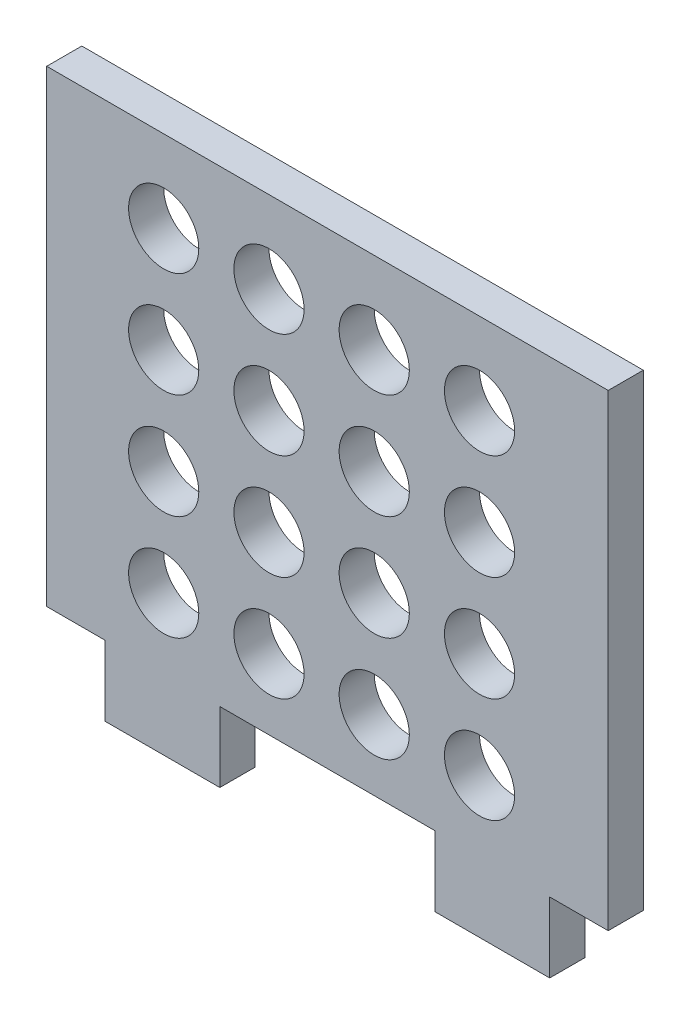
ISO-10303-21;
HEADER;
FILE_DESCRIPTION(('STEP AP214'),'2;1');
FILE_NAME('part.step','',(''),(''),'','','');
FILE_SCHEMA(('AUTOMOTIVE_DESIGN { 1 0 10303 214 1 1 1 1 }'));
ENDSEC;
DATA;
#1=APPLICATION_CONTEXT('core data for automotive mechanical design processes');
#2=APPLICATION_PROTOCOL_DEFINITION('international standard','automotive_design',2000,#1);
#3=PRODUCT_CONTEXT('',#1,'mechanical');
#4=PRODUCT('Part','Part','',(#3));
#5=PRODUCT_RELATED_PRODUCT_CATEGORY('part','',(#4));
#6=PRODUCT_DEFINITION_FORMATION('','',#4);
#7=PRODUCT_DEFINITION_CONTEXT('part definition',#1,'design');
#8=PRODUCT_DEFINITION('design','',#6,#7);
#9=PRODUCT_DEFINITION_SHAPE('','',#8);
#10=(LENGTH_UNIT() NAMED_UNIT(*) SI_UNIT(.MILLI.,.METRE.));
#11=(NAMED_UNIT(*) PLANE_ANGLE_UNIT() SI_UNIT($,.RADIAN.));
#12=(NAMED_UNIT(*) SI_UNIT($,.STERADIAN.) SOLID_ANGLE_UNIT());
#13=UNCERTAINTY_MEASURE_WITH_UNIT(LENGTH_MEASURE(1.E-05),#10,'distance_accuracy_value','');
#14=(GEOMETRIC_REPRESENTATION_CONTEXT(3) GLOBAL_UNCERTAINTY_ASSIGNED_CONTEXT((#13)) GLOBAL_UNIT_ASSIGNED_CONTEXT((#10,
#11,#12)) REPRESENTATION_CONTEXT('',''));
#15=CARTESIAN_POINT('',(0.,0.,0.));
#16=DIRECTION('',(0.,0.,1.));
#17=DIRECTION('',(1.,0.,0.));
#18=AXIS2_PLACEMENT_3D('',#15,#16,#17);
#19=CARTESIAN_POINT('',(-12.,0.,1.5));
#20=DIRECTION('',(0.,1.,0.));
#21=DIRECTION('',(0.,0.,1.));
#22=AXIS2_PLACEMENT_3D('',#19,#20,#21);
#23=PLANE('',#22);
#24=DIRECTION('',(0.,0.,-1.));
#25=VECTOR('',#24,1.);
#26=CARTESIAN_POINT('',(-4.6,0.,1.5));
#27=LINE('',#26,#25);
#28=CARTESIAN_POINT('',(-4.6,0.,1.5));
#29=VERTEX_POINT('',#28);
#30=CARTESIAN_POINT('',(-4.6,0.,0.));
#31=VERTEX_POINT('',#30);
#32=EDGE_CURVE('E129',#29,#31,#27,.T.);
#33=ORIENTED_EDGE('',*,*,#32,.T.);
#34=DIRECTION('',(1.,0.,0.));
#35=VECTOR('',#34,1.);
#36=CARTESIAN_POINT('',(-12.,0.,0.));
#37=LINE('',#36,#35);
#38=CARTESIAN_POINT('',(4.6,0.,0.));
#39=VERTEX_POINT('',#38);
#40=EDGE_CURVE('E192',#31,#39,#37,.T.);
#41=ORIENTED_EDGE('',*,*,#40,.T.);
#42=DIRECTION('',(0.,0.,-1.));
#43=VECTOR('',#42,1.);
#44=CARTESIAN_POINT('',(4.6,0.,1.5));
#45=LINE('',#44,#43);
#46=CARTESIAN_POINT('',(4.6,0.,1.5));
#47=VERTEX_POINT('',#46);
#48=EDGE_CURVE('E171',#47,#39,#45,.T.);
#49=ORIENTED_EDGE('',*,*,#48,.F.);
#50=DIRECTION('',(1.,0.,0.));
#51=VECTOR('',#50,1.);
#52=CARTESIAN_POINT('',(-12.,0.,1.5));
#53=LINE('',#52,#51);
#54=EDGE_CURVE('E47',#29,#47,#53,.T.);
#55=ORIENTED_EDGE('',*,*,#54,.F.);
#56=EDGE_LOOP('',(#33,#41,#49,#55));
#57=FACE_BOUND('',#56,.T.);
#58=ADVANCED_FACE('F32',(#57),#23,.F.);
#59=DIRECTION('',(0.,0.,-1.));
#60=VECTOR('',#59,1.);
#61=CARTESIAN_POINT('',(-9.5,0.,1.5));
#62=LINE('',#61,#60);
#63=CARTESIAN_POINT('',(-9.50000000000001,0.,1.5));
#64=VERTEX_POINT('',#63);
#65=CARTESIAN_POINT('',(-9.50000000000001,0.,0.));
#66=VERTEX_POINT('',#65);
#67=EDGE_CURVE('E55',#64,#66,#62,.T.);
#68=ORIENTED_EDGE('',*,*,#67,.F.);
#69=CARTESIAN_POINT('',(-12.,0.,1.5));
#70=VERTEX_POINT('',#69);
#71=EDGE_CURVE('E179',#70,#64,#53,.T.);
#72=ORIENTED_EDGE('',*,*,#71,.F.);
#73=DIRECTION('',(0.,0.,-1.));
#74=VECTOR('',#73,1.);
#75=CARTESIAN_POINT('',(-12.,0.,1.5));
#76=LINE('',#75,#74);
#77=CARTESIAN_POINT('',(-12.,0.,0.));
#78=VERTEX_POINT('',#77);
#79=EDGE_CURVE('E11',#70,#78,#76,.T.);
#80=ORIENTED_EDGE('',*,*,#79,.T.);
#81=EDGE_CURVE('E189',#78,#66,#37,.T.);
#82=ORIENTED_EDGE('',*,*,#81,.T.);
#83=EDGE_LOOP('',(#68,#72,#80,#82));
#84=FACE_BOUND('',#83,.T.);
#85=ADVANCED_FACE('F237',(#84),#23,.F.);
#86=CARTESIAN_POINT('',(-12.,20.,1.5));
#87=DIRECTION('',(1.,0.,0.));
#88=DIRECTION('',(0.,1.,0.));
#89=AXIS2_PLACEMENT_3D('',#86,#87,#88);
#90=PLANE('',#89);
#91=DIRECTION('',(0.,-1.,0.));
#92=VECTOR('',#91,1.);
#93=CARTESIAN_POINT('',(-12.,20.,0.));
#94=LINE('',#93,#92);
#95=CARTESIAN_POINT('',(-12.,20.,0.));
#96=VERTEX_POINT('',#95);
#97=EDGE_CURVE('E174',#96,#78,#94,.T.);
#98=ORIENTED_EDGE('',*,*,#97,.T.);
#99=ORIENTED_EDGE('',*,*,#79,.F.);
#100=DIRECTION('',(0.,-1.,0.));
#101=VECTOR('',#100,1.);
#102=CARTESIAN_POINT('',(-12.,20.,1.5));
#103=LINE('',#102,#101);
#104=CARTESIAN_POINT('',(-12.,20.,1.5));
#105=VERTEX_POINT('',#104);
#106=EDGE_CURVE('E175',#105,#70,#103,.T.);
#107=ORIENTED_EDGE('',*,*,#106,.F.);
#108=DIRECTION('',(0.,0.,-1.));
#109=VECTOR('',#108,1.);
#110=CARTESIAN_POINT('',(-12.,20.,1.5));
#111=LINE('',#110,#109);
#112=EDGE_CURVE('E185',#105,#96,#111,.T.);
#113=ORIENTED_EDGE('',*,*,#112,.T.);
#114=EDGE_LOOP('',(#98,#99,#107,#113));
#115=FACE_BOUND('',#114,.T.);
#116=ADVANCED_FACE('F34',(#115),#90,.F.);
#117=CARTESIAN_POINT('',(9.5,0.,1.5));
#118=VERTEX_POINT('',#117);
#119=CARTESIAN_POINT('',(12.,0.,1.5));
#120=VERTEX_POINT('',#119);
#121=EDGE_CURVE('E177',#118,#120,#53,.T.);
#122=ORIENTED_EDGE('',*,*,#121,.F.);
#123=DIRECTION('',(0.,0.,-1.));
#124=VECTOR('',#123,1.);
#125=CARTESIAN_POINT('',(9.5,0.,1.5));
#126=LINE('',#125,#124);
#127=CARTESIAN_POINT('',(9.5,0.,0.));
#128=VERTEX_POINT('',#127);
#129=EDGE_CURVE('E159',#118,#128,#126,.T.);
#130=ORIENTED_EDGE('',*,*,#129,.T.);
#131=CARTESIAN_POINT('',(12.,0.,0.));
#132=VERTEX_POINT('',#131);
#133=EDGE_CURVE('E188',#128,#132,#37,.T.);
#134=ORIENTED_EDGE('',*,*,#133,.T.);
#135=DIRECTION('',(0.,0.,-1.));
#136=VECTOR('',#135,1.);
#137=CARTESIAN_POINT('',(12.,0.,1.5));
#138=LINE('',#137,#136);
#139=EDGE_CURVE('E40',#120,#132,#138,.T.);
#140=ORIENTED_EDGE('',*,*,#139,.F.);
#141=EDGE_LOOP('',(#122,#130,#134,#140));
#142=FACE_BOUND('',#141,.T.);
#143=ADVANCED_FACE('F235',(#142),#23,.F.);
#144=CARTESIAN_POINT('',(12.,0.,1.5));
#145=DIRECTION('',(-1.,0.,0.));
#146=DIRECTION('',(0.,-1.,0.));
#147=AXIS2_PLACEMENT_3D('',#144,#145,#146);
#148=PLANE('',#147);
#149=DIRECTION('',(0.,1.,0.));
#150=VECTOR('',#149,1.);
#151=CARTESIAN_POINT('',(12.,0.,0.));
#152=LINE('',#151,#150);
#153=CARTESIAN_POINT('',(12.,20.,0.));
#154=VERTEX_POINT('',#153);
#155=EDGE_CURVE('E191',#132,#154,#152,.T.);
#156=ORIENTED_EDGE('',*,*,#155,.T.);
#157=DIRECTION('',(0.,0.,-1.));
#158=VECTOR('',#157,1.);
#159=CARTESIAN_POINT('',(12.,20.,1.5));
#160=LINE('',#159,#158);
#161=CARTESIAN_POINT('',(12.,20.,1.5));
#162=VERTEX_POINT('',#161);
#163=EDGE_CURVE('E197',#162,#154,#160,.T.);
#164=ORIENTED_EDGE('',*,*,#163,.F.);
#165=DIRECTION('',(0.,1.,0.));
#166=VECTOR('',#165,1.);
#167=CARTESIAN_POINT('',(12.,0.,1.5));
#168=LINE('',#167,#166);
#169=EDGE_CURVE('E181',#120,#162,#168,.T.);
#170=ORIENTED_EDGE('',*,*,#169,.F.);
#171=ORIENTED_EDGE('',*,*,#139,.T.);
#172=EDGE_LOOP('',(#156,#164,#170,#171));
#173=FACE_BOUND('',#172,.T.);
#174=ADVANCED_FACE('F204',(#173),#148,.F.);
#175=CARTESIAN_POINT('',(12.,20.,1.5));
#176=DIRECTION('',(0.,-1.,0.));
#177=DIRECTION('',(1.,0.,0.));
#178=AXIS2_PLACEMENT_3D('',#175,#176,#177);
#179=PLANE('',#178);
#180=DIRECTION('',(-1.,0.,0.));
#181=VECTOR('',#180,1.);
#182=CARTESIAN_POINT('',(12.,20.,0.));
#183=LINE('',#182,#181);
#184=EDGE_CURVE('E178',#154,#96,#183,.T.);
#185=ORIENTED_EDGE('',*,*,#184,.T.);
#186=ORIENTED_EDGE('',*,*,#112,.F.);
#187=DIRECTION('',(-1.,0.,0.));
#188=VECTOR('',#187,1.);
#189=CARTESIAN_POINT('',(12.,20.,1.5));
#190=LINE('',#189,#188);
#191=EDGE_CURVE('E183',#162,#105,#190,.T.);
#192=ORIENTED_EDGE('',*,*,#191,.F.);
#193=ORIENTED_EDGE('',*,*,#163,.T.);
#194=EDGE_LOOP('',(#185,#186,#192,#193));
#195=FACE_BOUND('',#194,.T.);
#196=ADVANCED_FACE('F216',(#195),#179,.F.);
#197=CARTESIAN_POINT('',(0.,0.,1.5));
#198=DIRECTION('',(0.,0.,1.));
#199=DIRECTION('',(1.,0.,0.));
#200=AXIS2_PLACEMENT_3D('',#197,#198,#199);
#201=PLANE('',#200);
#202=CARTESIAN_POINT('',(2.,12.,1.5));
#203=DIRECTION('',(0.,0.,1.));
#204=DIRECTION('',(1.,0.,0.));
#205=AXIS2_PLACEMENT_3D('',#202,#203,#204);
#206=CIRCLE('',#205,1.5);
#207=CARTESIAN_POINT('',(3.5,12.,1.5));
#208=VERTEX_POINT('',#207);
#209=EDGE_CURVE('E521',#208,#208,#206,.T.);
#210=ORIENTED_EDGE('',*,*,#209,.F.);
#211=EDGE_LOOP('',(#210));
#212=FACE_BOUND('',#211,.T.);
#213=CARTESIAN_POINT('',(-2.5,12.,1.5));
#214=DIRECTION('',(0.,0.,1.));
#215=DIRECTION('',(1.,0.,0.));
#216=AXIS2_PLACEMENT_3D('',#213,#214,#215);
#217=CIRCLE('',#216,1.5);
#218=CARTESIAN_POINT('',(-0.999999999999997,12.,1.5));
#219=VERTEX_POINT('',#218);
#220=EDGE_CURVE('E525',#219,#219,#217,.T.);
#221=ORIENTED_EDGE('',*,*,#220,.F.);
#222=EDGE_LOOP('',(#221));
#223=FACE_BOUND('',#222,.T.);
#224=CARTESIAN_POINT('',(6.5,7.5,1.5));
#225=DIRECTION('',(0.,0.,1.));
#226=DIRECTION('',(1.,0.,0.));
#227=AXIS2_PLACEMENT_3D('',#224,#225,#226);
#228=CIRCLE('',#227,1.5);
#229=CARTESIAN_POINT('',(8.,7.5,1.5));
#230=VERTEX_POINT('',#229);
#231=EDGE_CURVE('E627',#230,#230,#228,.T.);
#232=ORIENTED_EDGE('',*,*,#231,.F.);
#233=EDGE_LOOP('',(#232));
#234=FACE_BOUND('',#233,.T.);
#235=CARTESIAN_POINT('',(2.,7.5,1.5));
#236=DIRECTION('',(0.,0.,1.));
#237=DIRECTION('',(1.,0.,0.));
#238=AXIS2_PLACEMENT_3D('',#235,#236,#237);
#239=CIRCLE('',#238,1.5);
#240=CARTESIAN_POINT('',(3.5,7.5,1.5));
#241=VERTEX_POINT('',#240);
#242=EDGE_CURVE('E621',#241,#241,#239,.T.);
#243=ORIENTED_EDGE('',*,*,#242,.F.);
#244=EDGE_LOOP('',(#243));
#245=FACE_BOUND('',#244,.T.);
#246=CARTESIAN_POINT('',(-2.5,3.,1.5));
#247=DIRECTION('',(0.,0.,1.));
#248=DIRECTION('',(1.,0.,0.));
#249=AXIS2_PLACEMENT_3D('',#246,#247,#248);
#250=CIRCLE('',#249,1.5);
#251=CARTESIAN_POINT('',(-0.999999999999998,3.,1.5));
#252=VERTEX_POINT('',#251);
#253=EDGE_CURVE('E548',#252,#252,#250,.T.);
#254=ORIENTED_EDGE('',*,*,#253,.F.);
#255=EDGE_LOOP('',(#254));
#256=FACE_BOUND('',#255,.T.);
#257=CARTESIAN_POINT('',(2.,3.,1.5));
#258=DIRECTION('',(0.,0.,1.));
#259=DIRECTION('',(1.,0.,0.));
#260=AXIS2_PLACEMENT_3D('',#257,#258,#259);
#261=CIRCLE('',#260,1.5);
#262=CARTESIAN_POINT('',(3.5,3.,1.5));
#263=VERTEX_POINT('',#262);
#264=EDGE_CURVE('E541',#263,#263,#261,.T.);
#265=ORIENTED_EDGE('',*,*,#264,.F.);
#266=EDGE_LOOP('',(#265));
#267=FACE_BOUND('',#266,.T.);
#268=CARTESIAN_POINT('',(6.5,3.,1.5));
#269=DIRECTION('',(0.,0.,1.));
#270=DIRECTION('',(1.,0.,0.));
#271=AXIS2_PLACEMENT_3D('',#268,#269,#270);
#272=CIRCLE('',#271,1.5);
#273=CARTESIAN_POINT('',(8.,3.,1.5));
#274=VERTEX_POINT('',#273);
#275=EDGE_CURVE('E534',#274,#274,#272,.T.);
#276=ORIENTED_EDGE('',*,*,#275,.F.);
#277=EDGE_LOOP('',(#276));
#278=FACE_BOUND('',#277,.T.);
#279=CARTESIAN_POINT('',(-2.5,7.5,1.5));
#280=DIRECTION('',(0.,0.,1.));
#281=DIRECTION('',(1.,0.,0.));
#282=AXIS2_PLACEMENT_3D('',#279,#280,#281);
#283=CIRCLE('',#282,1.5);
#284=CARTESIAN_POINT('',(-0.999999999999997,7.5,1.5));
#285=VERTEX_POINT('',#284);
#286=EDGE_CURVE('E542',#285,#285,#283,.T.);
#287=ORIENTED_EDGE('',*,*,#286,.F.);
#288=EDGE_LOOP('',(#287));
#289=FACE_BOUND('',#288,.T.);
#290=CARTESIAN_POINT('',(6.5,16.5,1.5));
#291=DIRECTION('',(0.,0.,1.));
#292=DIRECTION('',(1.,0.,0.));
#293=AXIS2_PLACEMENT_3D('',#290,#291,#292);
#294=CIRCLE('',#293,1.5);
#295=CARTESIAN_POINT('',(8.,16.5,1.5));
#296=VERTEX_POINT('',#295);
#297=EDGE_CURVE('E660',#296,#296,#294,.T.);
#298=ORIENTED_EDGE('',*,*,#297,.F.);
#299=EDGE_LOOP('',(#298));
#300=FACE_BOUND('',#299,.T.);
#301=CARTESIAN_POINT('',(2.,16.5,1.5));
#302=DIRECTION('',(0.,0.,1.));
#303=DIRECTION('',(1.,0.,0.));
#304=AXIS2_PLACEMENT_3D('',#301,#302,#303);
#305=CIRCLE('',#304,1.5);
#306=CARTESIAN_POINT('',(3.5,16.5,1.5));
#307=VERTEX_POINT('',#306);
#308=EDGE_CURVE('E664',#307,#307,#305,.T.);
#309=ORIENTED_EDGE('',*,*,#308,.F.);
#310=EDGE_LOOP('',(#309));
#311=FACE_BOUND('',#310,.T.);
#312=CARTESIAN_POINT('',(-2.5,16.5,1.5));
#313=DIRECTION('',(0.,0.,1.));
#314=DIRECTION('',(1.,0.,0.));
#315=AXIS2_PLACEMENT_3D('',#312,#313,#314);
#316=CIRCLE('',#315,1.5);
#317=CARTESIAN_POINT('',(-0.999999999999995,16.5,1.5));
#318=VERTEX_POINT('',#317);
#319=EDGE_CURVE('E668',#318,#318,#316,.T.);
#320=ORIENTED_EDGE('',*,*,#319,.F.);
#321=EDGE_LOOP('',(#320));
#322=FACE_BOUND('',#321,.T.);
#323=CARTESIAN_POINT('',(6.5,12.,1.5));
#324=DIRECTION('',(0.,0.,1.));
#325=DIRECTION('',(1.,0.,0.));
#326=AXIS2_PLACEMENT_3D('',#323,#324,#325);
#327=CIRCLE('',#326,1.5);
#328=CARTESIAN_POINT('',(8.,12.,1.5));
#329=VERTEX_POINT('',#328);
#330=EDGE_CURVE('E672',#329,#329,#327,.T.);
#331=ORIENTED_EDGE('',*,*,#330,.F.);
#332=EDGE_LOOP('',(#331));
#333=FACE_BOUND('',#332,.T.);
#334=CARTESIAN_POINT('',(-7.,7.5,1.5));
#335=DIRECTION('',(0.,0.,1.));
#336=DIRECTION('',(1.,0.,0.));
#337=AXIS2_PLACEMENT_3D('',#334,#335,#336);
#338=CIRCLE('',#337,1.5);
#339=CARTESIAN_POINT('',(-5.5,7.5,1.5));
#340=VERTEX_POINT('',#339);
#341=EDGE_CURVE('E676',#340,#340,#338,.T.);
#342=ORIENTED_EDGE('',*,*,#341,.F.);
#343=EDGE_LOOP('',(#342));
#344=FACE_BOUND('',#343,.T.);
#345=CARTESIAN_POINT('',(-7.,12.,1.5));
#346=DIRECTION('',(0.,0.,1.));
#347=DIRECTION('',(1.,0.,0.));
#348=AXIS2_PLACEMENT_3D('',#345,#346,#347);
#349=CIRCLE('',#348,1.5);
#350=CARTESIAN_POINT('',(-5.5,12.,1.5));
#351=VERTEX_POINT('',#350);
#352=EDGE_CURVE('E612',#351,#351,#349,.T.);
#353=ORIENTED_EDGE('',*,*,#352,.F.);
#354=EDGE_LOOP('',(#353));
#355=FACE_BOUND('',#354,.T.);
#356=CARTESIAN_POINT('',(-7.,16.5,1.5));
#357=DIRECTION('',(0.,0.,1.));
#358=DIRECTION('',(1.,0.,0.));
#359=AXIS2_PLACEMENT_3D('',#356,#357,#358);
#360=CIRCLE('',#359,1.5);
#361=CARTESIAN_POINT('',(-5.49999999999999,16.5,1.5));
#362=VERTEX_POINT('',#361);
#363=EDGE_CURVE('E613',#362,#362,#360,.T.);
#364=ORIENTED_EDGE('',*,*,#363,.F.);
#365=EDGE_LOOP('',(#364));
#366=FACE_BOUND('',#365,.T.);
#367=CARTESIAN_POINT('',(-7.,3.,1.5));
#368=DIRECTION('',(0.,0.,1.));
#369=DIRECTION('',(1.,0.,0.));
#370=AXIS2_PLACEMENT_3D('',#367,#368,#369);
#371=CIRCLE('',#370,1.5);
#372=CARTESIAN_POINT('',(-5.5,3.,1.5));
#373=VERTEX_POINT('',#372);
#374=EDGE_CURVE('E555',#373,#373,#371,.T.);
#375=ORIENTED_EDGE('',*,*,#374,.F.);
#376=EDGE_LOOP('',(#375));
#377=FACE_BOUND('',#376,.T.);
#378=ORIENTED_EDGE('',*,*,#106,.T.);
#379=ORIENTED_EDGE('',*,*,#71,.T.);
#380=DIRECTION('',(0.,-1.,0.));
#381=VECTOR('',#380,1.);
#382=CARTESIAN_POINT('',(-9.5,-3.,1.5));
#383=LINE('',#382,#381);
#384=CARTESIAN_POINT('',(-9.5,-3.,1.5));
#385=VERTEX_POINT('',#384);
#386=EDGE_CURVE('E131',#64,#385,#383,.T.);
#387=ORIENTED_EDGE('',*,*,#386,.T.);
#388=DIRECTION('',(1.,0.,0.));
#389=VECTOR('',#388,1.);
#390=CARTESIAN_POINT('',(-4.6,-3.,1.5));
#391=LINE('',#390,#389);
#392=CARTESIAN_POINT('',(-4.6,-3.,1.5));
#393=VERTEX_POINT('',#392);
#394=EDGE_CURVE('E132',#385,#393,#391,.T.);
#395=ORIENTED_EDGE('',*,*,#394,.T.);
#396=DIRECTION('',(0.,1.,0.));
#397=VECTOR('',#396,1.);
#398=CARTESIAN_POINT('',(-4.6,0.,1.5));
#399=LINE('',#398,#397);
#400=EDGE_CURVE('E122',#393,#29,#399,.T.);
#401=ORIENTED_EDGE('',*,*,#400,.T.);
#402=ORIENTED_EDGE('',*,*,#54,.T.);
#403=DIRECTION('',(0.,-1.,0.));
#404=VECTOR('',#403,1.);
#405=CARTESIAN_POINT('',(4.6,0.,1.5));
#406=LINE('',#405,#404);
#407=CARTESIAN_POINT('',(4.6,-3.,1.5));
#408=VERTEX_POINT('',#407);
#409=EDGE_CURVE('E153',#47,#408,#406,.T.);
#410=ORIENTED_EDGE('',*,*,#409,.T.);
#411=DIRECTION('',(1.,0.,0.));
#412=VECTOR('',#411,1.);
#413=CARTESIAN_POINT('',(4.6,-3.,1.5));
#414=LINE('',#413,#412);
#415=CARTESIAN_POINT('',(9.5,-3.,1.5));
#416=VERTEX_POINT('',#415);
#417=EDGE_CURVE('E155',#408,#416,#414,.T.);
#418=ORIENTED_EDGE('',*,*,#417,.T.);
#419=DIRECTION('',(0.,1.,0.));
#420=VECTOR('',#419,1.);
#421=CARTESIAN_POINT('',(9.5,-3.,1.5));
#422=LINE('',#421,#420);
#423=EDGE_CURVE('E158',#416,#118,#422,.T.);
#424=ORIENTED_EDGE('',*,*,#423,.T.);
#425=ORIENTED_EDGE('',*,*,#121,.T.);
#426=ORIENTED_EDGE('',*,*,#169,.T.);
#427=ORIENTED_EDGE('',*,*,#191,.T.);
#428=EDGE_LOOP('',(#378,#379,#387,#395,#401,#402,#410,#418,#424,#425,#426,#427));
#429=FACE_BOUND('',#428,.T.);
#430=ADVANCED_FACE('F136',(#212,#223,#234,#245,#256,#267,#278,#289,#300,#311,#322,#333,#344,
#355,#366,#377,#429),#201,.T.);
#431=CARTESIAN_POINT('',(0.,0.,0.));
#432=DIRECTION('',(0.,0.,1.));
#433=DIRECTION('',(1.,0.,0.));
#434=AXIS2_PLACEMENT_3D('',#431,#432,#433);
#435=PLANE('',#434);
#436=CARTESIAN_POINT('',(2.,12.,0.));
#437=DIRECTION('',(0.,0.,1.));
#438=DIRECTION('',(1.,0.,0.));
#439=AXIS2_PLACEMENT_3D('',#436,#437,#438);
#440=CIRCLE('',#439,1.5);
#441=CARTESIAN_POINT('',(3.5,12.,0.));
#442=VERTEX_POINT('',#441);
#443=EDGE_CURVE('E524',#442,#442,#440,.F.);
#444=ORIENTED_EDGE('',*,*,#443,.F.);
#445=EDGE_LOOP('',(#444));
#446=FACE_BOUND('',#445,.T.);
#447=CARTESIAN_POINT('',(-2.5,12.,0.));
#448=DIRECTION('',(0.,0.,1.));
#449=DIRECTION('',(1.,0.,0.));
#450=AXIS2_PLACEMENT_3D('',#447,#448,#449);
#451=CIRCLE('',#450,1.5);
#452=CARTESIAN_POINT('',(-0.999999999999997,12.,0.));
#453=VERTEX_POINT('',#452);
#454=EDGE_CURVE('E528',#453,#453,#451,.F.);
#455=ORIENTED_EDGE('',*,*,#454,.F.);
#456=EDGE_LOOP('',(#455));
#457=FACE_BOUND('',#456,.T.);
#458=CARTESIAN_POINT('',(6.5,7.5,0.));
#459=DIRECTION('',(0.,0.,1.));
#460=DIRECTION('',(1.,0.,0.));
#461=AXIS2_PLACEMENT_3D('',#458,#459,#460);
#462=CIRCLE('',#461,1.5);
#463=CARTESIAN_POINT('',(8.,7.5,0.));
#464=VERTEX_POINT('',#463);
#465=EDGE_CURVE('E624',#464,#464,#462,.F.);
#466=ORIENTED_EDGE('',*,*,#465,.F.);
#467=EDGE_LOOP('',(#466));
#468=FACE_BOUND('',#467,.T.);
#469=CARTESIAN_POINT('',(2.,7.5,0.));
#470=DIRECTION('',(0.,0.,1.));
#471=DIRECTION('',(1.,0.,0.));
#472=AXIS2_PLACEMENT_3D('',#469,#470,#471);
#473=CIRCLE('',#472,1.5);
#474=CARTESIAN_POINT('',(3.5,7.5,0.));
#475=VERTEX_POINT('',#474);
#476=EDGE_CURVE('E545',#475,#475,#473,.F.);
#477=ORIENTED_EDGE('',*,*,#476,.F.);
#478=EDGE_LOOP('',(#477));
#479=FACE_BOUND('',#478,.T.);
#480=CARTESIAN_POINT('',(-2.5,3.,0.));
#481=DIRECTION('',(0.,0.,1.));
#482=DIRECTION('',(1.,0.,0.));
#483=AXIS2_PLACEMENT_3D('',#480,#481,#482);
#484=CIRCLE('',#483,1.5);
#485=CARTESIAN_POINT('',(-0.999999999999998,3.,0.));
#486=VERTEX_POINT('',#485);
#487=EDGE_CURVE('E551',#486,#486,#484,.F.);
#488=ORIENTED_EDGE('',*,*,#487,.F.);
#489=EDGE_LOOP('',(#488));
#490=FACE_BOUND('',#489,.T.);
#491=CARTESIAN_POINT('',(2.,3.,0.));
#492=DIRECTION('',(0.,0.,1.));
#493=DIRECTION('',(1.,0.,0.));
#494=AXIS2_PLACEMENT_3D('',#491,#492,#493);
#495=CIRCLE('',#494,1.5);
#496=CARTESIAN_POINT('',(3.5,3.,0.));
#497=VERTEX_POINT('',#496);
#498=EDGE_CURVE('E552',#497,#497,#495,.F.);
#499=ORIENTED_EDGE('',*,*,#498,.F.);
#500=EDGE_LOOP('',(#499));
#501=FACE_BOUND('',#500,.T.);
#502=CARTESIAN_POINT('',(6.5,3.,0.));
#503=DIRECTION('',(0.,0.,1.));
#504=DIRECTION('',(1.,0.,0.));
#505=AXIS2_PLACEMENT_3D('',#502,#503,#504);
#506=CIRCLE('',#505,1.5);
#507=CARTESIAN_POINT('',(8.,3.,0.));
#508=VERTEX_POINT('',#507);
#509=EDGE_CURVE('E537',#508,#508,#506,.F.);
#510=ORIENTED_EDGE('',*,*,#509,.F.);
#511=EDGE_LOOP('',(#510));
#512=FACE_BOUND('',#511,.T.);
#513=CARTESIAN_POINT('',(-2.5,7.5,0.));
#514=DIRECTION('',(0.,0.,1.));
#515=DIRECTION('',(1.,0.,0.));
#516=AXIS2_PLACEMENT_3D('',#513,#514,#515);
#517=CIRCLE('',#516,1.5);
#518=CARTESIAN_POINT('',(-0.999999999999997,7.5,0.));
#519=VERTEX_POINT('',#518);
#520=EDGE_CURVE('E538',#519,#519,#517,.F.);
#521=ORIENTED_EDGE('',*,*,#520,.F.);
#522=EDGE_LOOP('',(#521));
#523=FACE_BOUND('',#522,.T.);
#524=CARTESIAN_POINT('',(6.5,16.5,0.));
#525=DIRECTION('',(0.,0.,1.));
#526=DIRECTION('',(1.,0.,0.));
#527=AXIS2_PLACEMENT_3D('',#524,#525,#526);
#528=CIRCLE('',#527,1.5);
#529=CARTESIAN_POINT('',(8.,16.5,0.));
#530=VERTEX_POINT('',#529);
#531=EDGE_CURVE('E588',#530,#530,#528,.F.);
#532=ORIENTED_EDGE('',*,*,#531,.F.);
#533=EDGE_LOOP('',(#532));
#534=FACE_BOUND('',#533,.T.);
#535=CARTESIAN_POINT('',(2.,16.5,0.));
#536=DIRECTION('',(0.,0.,1.));
#537=DIRECTION('',(1.,0.,0.));
#538=AXIS2_PLACEMENT_3D('',#535,#536,#537);
#539=CIRCLE('',#538,1.5);
#540=CARTESIAN_POINT('',(3.5,16.5,0.));
#541=VERTEX_POINT('',#540);
#542=EDGE_CURVE('E592',#541,#541,#539,.F.);
#543=ORIENTED_EDGE('',*,*,#542,.F.);
#544=EDGE_LOOP('',(#543));
#545=FACE_BOUND('',#544,.T.);
#546=CARTESIAN_POINT('',(-2.5,16.5,0.));
#547=DIRECTION('',(0.,0.,1.));
#548=DIRECTION('',(1.,0.,0.));
#549=AXIS2_PLACEMENT_3D('',#546,#547,#548);
#550=CIRCLE('',#549,1.5);
#551=CARTESIAN_POINT('',(-0.999999999999995,16.5,0.));
#552=VERTEX_POINT('',#551);
#553=EDGE_CURVE('E596',#552,#552,#550,.F.);
#554=ORIENTED_EDGE('',*,*,#553,.F.);
#555=EDGE_LOOP('',(#554));
#556=FACE_BOUND('',#555,.T.);
#557=CARTESIAN_POINT('',(6.5,12.,0.));
#558=DIRECTION('',(0.,0.,1.));
#559=DIRECTION('',(1.,0.,0.));
#560=AXIS2_PLACEMENT_3D('',#557,#558,#559);
#561=CIRCLE('',#560,1.5);
#562=CARTESIAN_POINT('',(8.,12.,0.));
#563=VERTEX_POINT('',#562);
#564=EDGE_CURVE('E530',#563,#563,#561,.F.);
#565=ORIENTED_EDGE('',*,*,#564,.F.);
#566=EDGE_LOOP('',(#565));
#567=FACE_BOUND('',#566,.T.);
#568=CARTESIAN_POINT('',(-7.,7.5,0.));
#569=DIRECTION('',(0.,0.,1.));
#570=DIRECTION('',(1.,0.,0.));
#571=AXIS2_PLACEMENT_3D('',#568,#569,#570);
#572=CIRCLE('',#571,1.5);
#573=CARTESIAN_POINT('',(-5.5,7.5,0.));
#574=VERTEX_POINT('',#573);
#575=EDGE_CURVE('E603',#574,#574,#572,.F.);
#576=ORIENTED_EDGE('',*,*,#575,.F.);
#577=EDGE_LOOP('',(#576));
#578=FACE_BOUND('',#577,.T.);
#579=CARTESIAN_POINT('',(-7.,12.,0.));
#580=DIRECTION('',(0.,0.,1.));
#581=DIRECTION('',(1.,0.,0.));
#582=AXIS2_PLACEMENT_3D('',#579,#580,#581);
#583=CIRCLE('',#582,1.5);
#584=CARTESIAN_POINT('',(-5.5,12.,0.));
#585=VERTEX_POINT('',#584);
#586=EDGE_CURVE('E607',#585,#585,#583,.F.);
#587=ORIENTED_EDGE('',*,*,#586,.F.);
#588=EDGE_LOOP('',(#587));
#589=FACE_BOUND('',#588,.T.);
#590=CARTESIAN_POINT('',(-7.,16.5,0.));
#591=DIRECTION('',(0.,0.,1.));
#592=DIRECTION('',(1.,0.,0.));
#593=AXIS2_PLACEMENT_3D('',#590,#591,#592);
#594=CIRCLE('',#593,1.5);
#595=CARTESIAN_POINT('',(-5.49999999999999,16.5,0.));
#596=VERTEX_POINT('',#595);
#597=EDGE_CURVE('E610',#596,#596,#594,.F.);
#598=ORIENTED_EDGE('',*,*,#597,.F.);
#599=EDGE_LOOP('',(#598));
#600=FACE_BOUND('',#599,.T.);
#601=CARTESIAN_POINT('',(-7.,3.,0.));
#602=DIRECTION('',(0.,0.,1.));
#603=DIRECTION('',(1.,0.,0.));
#604=AXIS2_PLACEMENT_3D('',#601,#602,#603);
#605=CIRCLE('',#604,1.5);
#606=CARTESIAN_POINT('',(-5.5,3.,0.));
#607=VERTEX_POINT('',#606);
#608=EDGE_CURVE('E562',#607,#607,#605,.F.);
#609=ORIENTED_EDGE('',*,*,#608,.F.);
#610=EDGE_LOOP('',(#609));
#611=FACE_BOUND('',#610,.T.);
#612=ORIENTED_EDGE('',*,*,#97,.F.);
#613=ORIENTED_EDGE('',*,*,#184,.F.);
#614=ORIENTED_EDGE('',*,*,#155,.F.);
#615=ORIENTED_EDGE('',*,*,#133,.F.);
#616=DIRECTION('',(0.,1.,0.));
#617=VECTOR('',#616,1.);
#618=CARTESIAN_POINT('',(9.5,-3.,0.));
#619=LINE('',#618,#617);
#620=CARTESIAN_POINT('',(9.5,-3.,0.));
#621=VERTEX_POINT('',#620);
#622=EDGE_CURVE('E156',#621,#128,#619,.T.);
#623=ORIENTED_EDGE('',*,*,#622,.F.);
#624=DIRECTION('',(1.,0.,0.));
#625=VECTOR('',#624,1.);
#626=CARTESIAN_POINT('',(4.6,-3.,0.));
#627=LINE('',#626,#625);
#628=CARTESIAN_POINT('',(4.6,-3.,0.));
#629=VERTEX_POINT('',#628);
#630=EDGE_CURVE('E148',#629,#621,#627,.T.);
#631=ORIENTED_EDGE('',*,*,#630,.F.);
#632=DIRECTION('',(0.,-1.,0.));
#633=VECTOR('',#632,1.);
#634=CARTESIAN_POINT('',(4.6,0.,0.));
#635=LINE('',#634,#633);
#636=EDGE_CURVE('E146',#39,#629,#635,.T.);
#637=ORIENTED_EDGE('',*,*,#636,.F.);
#638=ORIENTED_EDGE('',*,*,#40,.F.);
#639=DIRECTION('',(0.,1.,0.));
#640=VECTOR('',#639,1.);
#641=CARTESIAN_POINT('',(-4.6,0.,0.));
#642=LINE('',#641,#640);
#643=CARTESIAN_POINT('',(-4.6,-3.,0.));
#644=VERTEX_POINT('',#643);
#645=EDGE_CURVE('E568',#644,#31,#642,.T.);
#646=ORIENTED_EDGE('',*,*,#645,.F.);
#647=DIRECTION('',(1.,0.,0.));
#648=VECTOR('',#647,1.);
#649=CARTESIAN_POINT('',(-4.6,-3.,0.));
#650=LINE('',#649,#648);
#651=CARTESIAN_POINT('',(-9.5,-3.,0.));
#652=VERTEX_POINT('',#651);
#653=EDGE_CURVE('E145',#652,#644,#650,.T.);
#654=ORIENTED_EDGE('',*,*,#653,.F.);
#655=DIRECTION('',(0.,-1.,0.));
#656=VECTOR('',#655,1.);
#657=CARTESIAN_POINT('',(-9.5,-3.,0.));
#658=LINE('',#657,#656);
#659=EDGE_CURVE('E141',#66,#652,#658,.T.);
#660=ORIENTED_EDGE('',*,*,#659,.F.);
#661=ORIENTED_EDGE('',*,*,#81,.F.);
#662=EDGE_LOOP('',(#612,#613,#614,#615,#623,#631,#637,#638,#646,#654,#660,#661));
#663=FACE_BOUND('',#662,.T.);
#664=ADVANCED_FACE('F212',(#446,#457,#468,#479,#490,#501,#512,#523,#534,#545,#556,#567,#578,
#589,#600,#611,#663),#435,.F.);
#665=CARTESIAN_POINT('',(4.6,0.,1.5));
#666=DIRECTION('',(1.,0.,0.));
#667=DIRECTION('',(0.,1.,0.));
#668=AXIS2_PLACEMENT_3D('',#665,#666,#667);
#669=PLANE('',#668);
#670=ORIENTED_EDGE('',*,*,#636,.T.);
#671=DIRECTION('',(0.,0.,-1.));
#672=VECTOR('',#671,1.);
#673=CARTESIAN_POINT('',(4.6,-3.,1.5));
#674=LINE('',#673,#672);
#675=EDGE_CURVE('E168',#408,#629,#674,.T.);
#676=ORIENTED_EDGE('',*,*,#675,.F.);
#677=ORIENTED_EDGE('',*,*,#409,.F.);
#678=ORIENTED_EDGE('',*,*,#48,.T.);
#679=EDGE_LOOP('',(#670,#676,#677,#678));
#680=FACE_BOUND('',#679,.T.);
#681=ADVANCED_FACE('F226',(#680),#669,.F.);
#682=CARTESIAN_POINT('',(4.6,-3.,1.5));
#683=DIRECTION('',(0.,1.,0.));
#684=DIRECTION('',(0.,0.,1.));
#685=AXIS2_PLACEMENT_3D('',#682,#683,#684);
#686=PLANE('',#685);
#687=ORIENTED_EDGE('',*,*,#630,.T.);
#688=DIRECTION('',(0.,0.,-1.));
#689=VECTOR('',#688,1.);
#690=CARTESIAN_POINT('',(9.5,-3.,1.5));
#691=LINE('',#690,#689);
#692=EDGE_CURVE('E165',#416,#621,#691,.T.);
#693=ORIENTED_EDGE('',*,*,#692,.F.);
#694=ORIENTED_EDGE('',*,*,#417,.F.);
#695=ORIENTED_EDGE('',*,*,#675,.T.);
#696=EDGE_LOOP('',(#687,#693,#694,#695));
#697=FACE_BOUND('',#696,.T.);
#698=ADVANCED_FACE('F231',(#697),#686,.F.);
#699=CARTESIAN_POINT('',(9.5,-3.,1.5));
#700=DIRECTION('',(-1.,0.,0.));
#701=DIRECTION('',(0.,0.,1.));
#702=AXIS2_PLACEMENT_3D('',#699,#700,#701);
#703=PLANE('',#702);
#704=ORIENTED_EDGE('',*,*,#622,.T.);
#705=ORIENTED_EDGE('',*,*,#129,.F.);
#706=ORIENTED_EDGE('',*,*,#423,.F.);
#707=ORIENTED_EDGE('',*,*,#692,.T.);
#708=EDGE_LOOP('',(#704,#705,#706,#707));
#709=FACE_BOUND('',#708,.T.);
#710=ADVANCED_FACE('F234',(#709),#703,.F.);
#711=CARTESIAN_POINT('',(-4.6,-3.,1.5));
#712=DIRECTION('',(0.,1.,0.));
#713=DIRECTION('',(0.,0.,1.));
#714=AXIS2_PLACEMENT_3D('',#711,#712,#713);
#715=PLANE('',#714);
#716=ORIENTED_EDGE('',*,*,#653,.T.);
#717=DIRECTION('',(0.,0.,-1.));
#718=VECTOR('',#717,1.);
#719=CARTESIAN_POINT('',(-4.6,-3.,1.5));
#720=LINE('',#719,#718);
#721=EDGE_CURVE('E127',#393,#644,#720,.T.);
#722=ORIENTED_EDGE('',*,*,#721,.F.);
#723=ORIENTED_EDGE('',*,*,#394,.F.);
#724=DIRECTION('',(0.,0.,-1.));
#725=VECTOR('',#724,1.);
#726=CARTESIAN_POINT('',(-9.5,-3.,1.5));
#727=LINE('',#726,#725);
#728=EDGE_CURVE('E566',#385,#652,#727,.T.);
#729=ORIENTED_EDGE('',*,*,#728,.T.);
#730=EDGE_LOOP('',(#716,#722,#723,#729));
#731=FACE_BOUND('',#730,.T.);
#732=ADVANCED_FACE('F143',(#731),#715,.F.);
#733=CARTESIAN_POINT('',(-4.6,0.,1.5));
#734=DIRECTION('',(-1.,0.,0.));
#735=DIRECTION('',(0.,-1.,0.));
#736=AXIS2_PLACEMENT_3D('',#733,#734,#735);
#737=PLANE('',#736);
#738=ORIENTED_EDGE('',*,*,#645,.T.);
#739=ORIENTED_EDGE('',*,*,#32,.F.);
#740=ORIENTED_EDGE('',*,*,#400,.F.);
#741=ORIENTED_EDGE('',*,*,#721,.T.);
#742=EDGE_LOOP('',(#738,#739,#740,#741));
#743=FACE_BOUND('',#742,.T.);
#744=ADVANCED_FACE('F125',(#743),#737,.F.);
#745=CARTESIAN_POINT('',(-9.5,-3.,1.5));
#746=DIRECTION('',(1.,0.,0.));
#747=DIRECTION('',(0.,0.,-1.));
#748=AXIS2_PLACEMENT_3D('',#745,#746,#747);
#749=PLANE('',#748);
#750=ORIENTED_EDGE('',*,*,#659,.T.);
#751=ORIENTED_EDGE('',*,*,#728,.F.);
#752=ORIENTED_EDGE('',*,*,#386,.F.);
#753=ORIENTED_EDGE('',*,*,#67,.T.);
#754=EDGE_LOOP('',(#750,#751,#752,#753));
#755=FACE_BOUND('',#754,.T.);
#756=ADVANCED_FACE('F342',(#755),#749,.F.);
#757=CARTESIAN_POINT('',(-7.,3.,-0.000999999999999916));
#758=DIRECTION('',(0.,0.,1.));
#759=DIRECTION('',(1.,0.,0.));
#760=AXIS2_PLACEMENT_3D('',#757,#758,#759);
#761=CYLINDRICAL_SURFACE('',#760,1.5);
#762=ORIENTED_EDGE('',*,*,#374,.T.);
#763=EDGE_LOOP('',(#762));
#764=FACE_BOUND('',#763,.T.);
#765=ORIENTED_EDGE('',*,*,#608,.T.);
#766=EDGE_LOOP('',(#765));
#767=FACE_BOUND('',#766,.T.);
#768=ADVANCED_FACE('F349',(#764,#767),#761,.F.);
#769=CARTESIAN_POINT('',(-7.,16.5,-0.000999999999999916));
#770=DIRECTION('',(0.,0.,1.));
#771=DIRECTION('',(1.,0.,0.));
#772=AXIS2_PLACEMENT_3D('',#769,#770,#771);
#773=CYLINDRICAL_SURFACE('',#772,1.5);
#774=ORIENTED_EDGE('',*,*,#363,.T.);
#775=EDGE_LOOP('',(#774));
#776=FACE_BOUND('',#775,.T.);
#777=ORIENTED_EDGE('',*,*,#597,.T.);
#778=EDGE_LOOP('',(#777));
#779=FACE_BOUND('',#778,.T.);
#780=ADVANCED_FACE('F357',(#776,#779),#773,.F.);
#781=CARTESIAN_POINT('',(-7.,12.,-0.000999999999999916));
#782=DIRECTION('',(0.,0.,1.));
#783=DIRECTION('',(1.,0.,0.));
#784=AXIS2_PLACEMENT_3D('',#781,#782,#783);
#785=CYLINDRICAL_SURFACE('',#784,1.5);
#786=ORIENTED_EDGE('',*,*,#352,.T.);
#787=EDGE_LOOP('',(#786));
#788=FACE_BOUND('',#787,.T.);
#789=ORIENTED_EDGE('',*,*,#586,.T.);
#790=EDGE_LOOP('',(#789));
#791=FACE_BOUND('',#790,.T.);
#792=ADVANCED_FACE('F366',(#788,#791),#785,.F.);
#793=CARTESIAN_POINT('',(-7.,7.5,-0.000999999999999916));
#794=DIRECTION('',(0.,0.,1.));
#795=DIRECTION('',(1.,0.,0.));
#796=AXIS2_PLACEMENT_3D('',#793,#794,#795);
#797=CYLINDRICAL_SURFACE('',#796,1.5);
#798=ORIENTED_EDGE('',*,*,#341,.T.);
#799=EDGE_LOOP('',(#798));
#800=FACE_BOUND('',#799,.T.);
#801=ORIENTED_EDGE('',*,*,#575,.T.);
#802=EDGE_LOOP('',(#801));
#803=FACE_BOUND('',#802,.T.);
#804=ADVANCED_FACE('F375',(#800,#803),#797,.F.);
#805=CARTESIAN_POINT('',(6.5,12.,-0.000999999999999916));
#806=DIRECTION('',(0.,0.,1.));
#807=DIRECTION('',(1.,0.,0.));
#808=AXIS2_PLACEMENT_3D('',#805,#806,#807);
#809=CYLINDRICAL_SURFACE('',#808,1.5);
#810=ORIENTED_EDGE('',*,*,#330,.T.);
#811=EDGE_LOOP('',(#810));
#812=FACE_BOUND('',#811,.T.);
#813=ORIENTED_EDGE('',*,*,#564,.T.);
#814=EDGE_LOOP('',(#813));
#815=FACE_BOUND('',#814,.T.);
#816=ADVANCED_FACE('F384',(#812,#815),#809,.F.);
#817=CARTESIAN_POINT('',(-2.5,16.5,-0.000999999999999916));
#818=DIRECTION('',(0.,0.,1.));
#819=DIRECTION('',(1.,0.,0.));
#820=AXIS2_PLACEMENT_3D('',#817,#818,#819);
#821=CYLINDRICAL_SURFACE('',#820,1.5);
#822=ORIENTED_EDGE('',*,*,#319,.T.);
#823=EDGE_LOOP('',(#822));
#824=FACE_BOUND('',#823,.T.);
#825=ORIENTED_EDGE('',*,*,#553,.T.);
#826=EDGE_LOOP('',(#825));
#827=FACE_BOUND('',#826,.T.);
#828=ADVANCED_FACE('F393',(#824,#827),#821,.F.);
#829=CARTESIAN_POINT('',(2.,16.5,-0.000999999999999916));
#830=DIRECTION('',(0.,0.,1.));
#831=DIRECTION('',(1.,0.,0.));
#832=AXIS2_PLACEMENT_3D('',#829,#830,#831);
#833=CYLINDRICAL_SURFACE('',#832,1.5);
#834=ORIENTED_EDGE('',*,*,#308,.T.);
#835=EDGE_LOOP('',(#834));
#836=FACE_BOUND('',#835,.T.);
#837=ORIENTED_EDGE('',*,*,#542,.T.);
#838=EDGE_LOOP('',(#837));
#839=FACE_BOUND('',#838,.T.);
#840=ADVANCED_FACE('F402',(#836,#839),#833,.F.);
#841=CARTESIAN_POINT('',(6.5,16.5,-0.000999999999999916));
#842=DIRECTION('',(0.,0.,1.));
#843=DIRECTION('',(1.,0.,0.));
#844=AXIS2_PLACEMENT_3D('',#841,#842,#843);
#845=CYLINDRICAL_SURFACE('',#844,1.5);
#846=ORIENTED_EDGE('',*,*,#297,.T.);
#847=EDGE_LOOP('',(#846));
#848=FACE_BOUND('',#847,.T.);
#849=ORIENTED_EDGE('',*,*,#531,.T.);
#850=EDGE_LOOP('',(#849));
#851=FACE_BOUND('',#850,.T.);
#852=ADVANCED_FACE('F411',(#848,#851),#845,.F.);
#853=CARTESIAN_POINT('',(-2.5,7.5,-0.000999999999999916));
#854=DIRECTION('',(0.,0.,1.));
#855=DIRECTION('',(1.,0.,0.));
#856=AXIS2_PLACEMENT_3D('',#853,#854,#855);
#857=CYLINDRICAL_SURFACE('',#856,1.5);
#858=ORIENTED_EDGE('',*,*,#286,.T.);
#859=EDGE_LOOP('',(#858));
#860=FACE_BOUND('',#859,.T.);
#861=ORIENTED_EDGE('',*,*,#520,.T.);
#862=EDGE_LOOP('',(#861));
#863=FACE_BOUND('',#862,.T.);
#864=ADVANCED_FACE('F420',(#860,#863),#857,.F.);
#865=CARTESIAN_POINT('',(6.5,3.,-0.000999999999999916));
#866=DIRECTION('',(0.,0.,1.));
#867=DIRECTION('',(1.,0.,0.));
#868=AXIS2_PLACEMENT_3D('',#865,#866,#867);
#869=CYLINDRICAL_SURFACE('',#868,1.5);
#870=ORIENTED_EDGE('',*,*,#275,.T.);
#871=EDGE_LOOP('',(#870));
#872=FACE_BOUND('',#871,.T.);
#873=ORIENTED_EDGE('',*,*,#509,.T.);
#874=EDGE_LOOP('',(#873));
#875=FACE_BOUND('',#874,.T.);
#876=ADVANCED_FACE('F429',(#872,#875),#869,.F.);
#877=CARTESIAN_POINT('',(2.,3.,-0.000999999999999916));
#878=DIRECTION('',(0.,0.,1.));
#879=DIRECTION('',(1.,0.,0.));
#880=AXIS2_PLACEMENT_3D('',#877,#878,#879);
#881=CYLINDRICAL_SURFACE('',#880,1.5);
#882=ORIENTED_EDGE('',*,*,#264,.T.);
#883=EDGE_LOOP('',(#882));
#884=FACE_BOUND('',#883,.T.);
#885=ORIENTED_EDGE('',*,*,#498,.T.);
#886=EDGE_LOOP('',(#885));
#887=FACE_BOUND('',#886,.T.);
#888=ADVANCED_FACE('F438',(#884,#887),#881,.F.);
#889=CARTESIAN_POINT('',(-2.5,3.,-0.000999999999999916));
#890=DIRECTION('',(0.,0.,1.));
#891=DIRECTION('',(1.,0.,0.));
#892=AXIS2_PLACEMENT_3D('',#889,#890,#891);
#893=CYLINDRICAL_SURFACE('',#892,1.5);
#894=ORIENTED_EDGE('',*,*,#253,.T.);
#895=EDGE_LOOP('',(#894));
#896=FACE_BOUND('',#895,.T.);
#897=ORIENTED_EDGE('',*,*,#487,.T.);
#898=EDGE_LOOP('',(#897));
#899=FACE_BOUND('',#898,.T.);
#900=ADVANCED_FACE('F447',(#896,#899),#893,.F.);
#901=CARTESIAN_POINT('',(2.,7.5,-0.000999999999999916));
#902=DIRECTION('',(0.,0.,1.));
#903=DIRECTION('',(1.,0.,0.));
#904=AXIS2_PLACEMENT_3D('',#901,#902,#903);
#905=CYLINDRICAL_SURFACE('',#904,1.5);
#906=ORIENTED_EDGE('',*,*,#242,.T.);
#907=EDGE_LOOP('',(#906));
#908=FACE_BOUND('',#907,.T.);
#909=ORIENTED_EDGE('',*,*,#476,.T.);
#910=EDGE_LOOP('',(#909));
#911=FACE_BOUND('',#910,.T.);
#912=ADVANCED_FACE('F456',(#908,#911),#905,.F.);
#913=CARTESIAN_POINT('',(6.5,7.5,-0.000999999999999916));
#914=DIRECTION('',(0.,0.,1.));
#915=DIRECTION('',(1.,0.,0.));
#916=AXIS2_PLACEMENT_3D('',#913,#914,#915);
#917=CYLINDRICAL_SURFACE('',#916,1.5);
#918=ORIENTED_EDGE('',*,*,#231,.T.);
#919=EDGE_LOOP('',(#918));
#920=FACE_BOUND('',#919,.T.);
#921=ORIENTED_EDGE('',*,*,#465,.T.);
#922=EDGE_LOOP('',(#921));
#923=FACE_BOUND('',#922,.T.);
#924=ADVANCED_FACE('F465',(#920,#923),#917,.F.);
#925=CARTESIAN_POINT('',(-2.5,12.,-0.000999999999999916));
#926=DIRECTION('',(0.,0.,1.));
#927=DIRECTION('',(1.,0.,0.));
#928=AXIS2_PLACEMENT_3D('',#925,#926,#927);
#929=CYLINDRICAL_SURFACE('',#928,1.5);
#930=ORIENTED_EDGE('',*,*,#220,.T.);
#931=EDGE_LOOP('',(#930));
#932=FACE_BOUND('',#931,.T.);
#933=ORIENTED_EDGE('',*,*,#454,.T.);
#934=EDGE_LOOP('',(#933));
#935=FACE_BOUND('',#934,.T.);
#936=ADVANCED_FACE('F474',(#932,#935),#929,.F.);
#937=CARTESIAN_POINT('',(2.,12.,-0.000999999999999916));
#938=DIRECTION('',(0.,0.,1.));
#939=DIRECTION('',(1.,0.,0.));
#940=AXIS2_PLACEMENT_3D('',#937,#938,#939);
#941=CYLINDRICAL_SURFACE('',#940,1.5);
#942=ORIENTED_EDGE('',*,*,#209,.T.);
#943=EDGE_LOOP('',(#942));
#944=FACE_BOUND('',#943,.T.);
#945=ORIENTED_EDGE('',*,*,#443,.T.);
#946=EDGE_LOOP('',(#945));
#947=FACE_BOUND('',#946,.T.);
#948=ADVANCED_FACE('F483',(#944,#947),#941,.F.);
#949=CLOSED_SHELL('',(#58,#85,#116,#143,#174,#196,#430,#664,#681,#698,#710,#732,#744,#756,#768,
#780,#792,#804,#816,#828,#840,#852,#864,#876,#888,#900,#912,#924,#936,#948));
#950=MANIFOLD_SOLID_BREP('B2',#949);
#951=ADVANCED_BREP_SHAPE_REPRESENTATION('',(#18,#950),#14);
#952=SHAPE_DEFINITION_REPRESENTATION(#9,#951);
ENDSEC;
END-ISO-10303-21;
